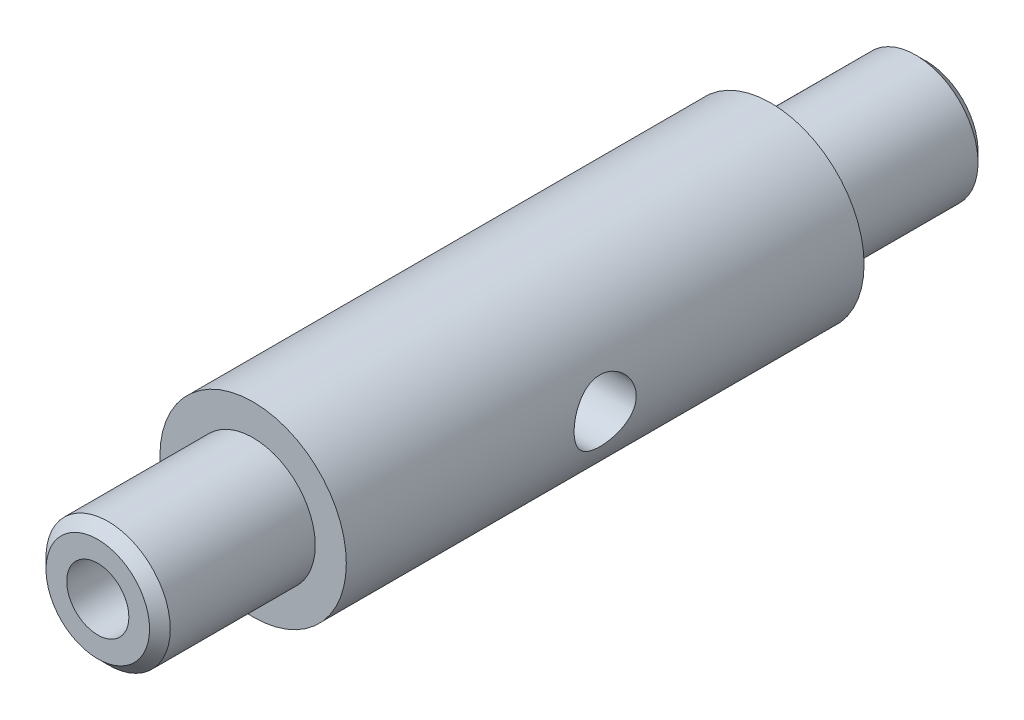
ISO-10303-21;
HEADER;
FILE_DESCRIPTION(('STEP AP214'),'2;1');
FILE_NAME('part.step','',(''),(''),'','','');
FILE_SCHEMA(('AUTOMOTIVE_DESIGN { 1 0 10303 214 1 1 1 1 }'));
ENDSEC;
DATA;
#1=APPLICATION_CONTEXT('core data for automotive mechanical design processes');
#2=APPLICATION_PROTOCOL_DEFINITION('international standard','automotive_design',2000,#1);
#3=PRODUCT_CONTEXT('',#1,'mechanical');
#4=PRODUCT('Part','Part','',(#3));
#5=PRODUCT_RELATED_PRODUCT_CATEGORY('part','',(#4));
#6=PRODUCT_DEFINITION_FORMATION('','',#4);
#7=PRODUCT_DEFINITION_CONTEXT('part definition',#1,'design');
#8=PRODUCT_DEFINITION('design','',#6,#7);
#9=PRODUCT_DEFINITION_SHAPE('','',#8);
#10=(LENGTH_UNIT() NAMED_UNIT(*) SI_UNIT(.MILLI.,.METRE.));
#11=(NAMED_UNIT(*) PLANE_ANGLE_UNIT() SI_UNIT($,.RADIAN.));
#12=(NAMED_UNIT(*) SI_UNIT($,.STERADIAN.) SOLID_ANGLE_UNIT());
#13=UNCERTAINTY_MEASURE_WITH_UNIT(LENGTH_MEASURE(1.E-05),#10,'distance_accuracy_value','');
#14=(GEOMETRIC_REPRESENTATION_CONTEXT(3) GLOBAL_UNCERTAINTY_ASSIGNED_CONTEXT((#13)) GLOBAL_UNIT_ASSIGNED_CONTEXT((#10,
#11,#12)) REPRESENTATION_CONTEXT('',''));
#15=CARTESIAN_POINT('',(0.,0.,0.));
#16=DIRECTION('',(0.,0.,1.));
#17=DIRECTION('',(1.,0.,0.));
#18=AXIS2_PLACEMENT_3D('',#15,#16,#17);
#19=CARTESIAN_POINT('',(-10.,0.,0.));
#20=DIRECTION('',(1.,0.,0.));
#21=DIRECTION('',(0.,0.,-1.));
#22=AXIS2_PLACEMENT_3D('',#19,#20,#21);
#23=CYLINDRICAL_SURFACE('',#22,3.);
#24=CARTESIAN_POINT('',(9.,0.,-3.));
#25=CARTESIAN_POINT('',(9.00000045902832,-0.16369008866017,-3.00000076119492));
#26=CARTESIAN_POINT('',(8.99549308522634,-0.32737558361565,-2.98655920161835));
#27=CARTESIAN_POINT('',(8.97795630609842,-0.649925282618917,-2.93331267354834));
#28=CARTESIAN_POINT('',(8.96492601606458,-0.808788984356454,-2.89350496815323));
#29=CARTESIAN_POINT('',(8.93175923719328,-1.11699836850533,-2.78904226984785));
#30=CARTESIAN_POINT('',(8.9116346319256,-1.2663594776581,-2.72442881262218));
#31=CARTESIAN_POINT('',(8.86633337152025,-1.55212481041597,-2.57237648148496));
#32=CARTESIAN_POINT('',(8.84115572003334,-1.68852647087612,-2.4849331049922));
#33=CARTESIAN_POINT('',(8.78742283329015,-1.9492250250668,-2.28652258542374));
#34=CARTESIAN_POINT('',(8.75878669391354,-2.07301110089493,-2.17490629721852));
#35=CARTESIAN_POINT('',(8.70180944349364,-2.30049807810625,-1.9326985358803));
#36=CARTESIAN_POINT('',(8.67346839871647,-2.40419455646839,-1.80210289521446));
#37=CARTESIAN_POINT('',(8.61939997431821,-2.59147482668358,-1.52104465441062));
#38=CARTESIAN_POINT('',(8.59377117827064,-2.6743945746631,-1.37011878080363));
#39=CARTESIAN_POINT('',(8.54925916255803,-2.81345662163317,-1.05547171662436));
#40=CARTESIAN_POINT('',(8.53037388482237,-2.8696070921603,-0.891754448511769));
#41=CARTESIAN_POINT('',(8.50233909808131,-2.95162038452749,-0.561980335509869));
#42=CARTESIAN_POINT('',(8.49288287308834,-2.97844034481531,-0.396188374532807));
#43=CARTESIAN_POINT('',(8.48386969888523,-3.00402337000343,-0.0622087375323575));
#44=CARTESIAN_POINT('',(8.4843096906819,-3.00279510481416,0.105978182127571));
#45=CARTESIAN_POINT('',(8.4947704502454,-2.97305971111026,0.431809891332064));
#46=CARTESIAN_POINT('',(8.50435247602599,-2.94580173950098,0.589585208757057));
#47=CARTESIAN_POINT('',(8.53129973173653,-2.86681848854825,0.898180258820504));
#48=CARTESIAN_POINT('',(8.54866589352323,-2.81509027977561,1.04899915630521));
#49=CARTESIAN_POINT('',(8.58953733393746,-2.68781717418063,1.34223824877444));
#50=CARTESIAN_POINT('',(8.61313697379352,-2.61190214612179,1.48448407640858));
#51=CARTESIAN_POINT('',(8.66377675727179,-2.43866731890942,1.75461272483918));
#52=CARTESIAN_POINT('',(8.69081789371391,-2.34134133709202,1.88249138080014));
#53=CARTESIAN_POINT('',(8.74701987503223,-2.12204799804671,2.12727479448232));
#54=CARTESIAN_POINT('',(8.77621768064528,-1.99905945022893,2.24325808352721));
#55=CARTESIAN_POINT('',(8.8322081516111,-1.73501870991019,2.45319379999019));
#56=CARTESIAN_POINT('',(8.85900058614202,-1.59396478698244,2.54714411449349));
#57=CARTESIAN_POINT('',(8.90751323813381,-1.2958428391388,2.71108890070521));
#58=CARTESIAN_POINT('',(8.92918050024118,-1.13862982924901,2.7808364740222));
#59=CARTESIAN_POINT('',(8.96461701433304,-0.813807250093523,2.89260952186713));
#60=CARTESIAN_POINT('',(8.97838900964638,-0.646201314464861,2.93464462627031));
#61=CARTESIAN_POINT('',(8.99602881214321,-0.313151488587913,2.98816699806708));
#62=CARTESIAN_POINT('',(9.00030005501184,-0.147928799594539,3.00089942751825));
#63=CARTESIAN_POINT('',(8.99966708084482,0.182325209880712,2.99900197920459));
#64=CARTESIAN_POINT('',(8.99476441258087,0.347356557958951,2.98437672006037));
#65=CARTESIAN_POINT('',(8.97660074151313,0.667559598912766,2.92916427679212));
#66=CARTESIAN_POINT('',(8.96358596133577,0.822878420504529,2.88934138185152));
#67=CARTESIAN_POINT('',(8.9307554049021,1.12456787573872,2.78581966659982));
#68=CARTESIAN_POINT('',(8.91093876140025,1.27093736552582,2.72211780159664));
#69=CARTESIAN_POINT('',(8.86586793861869,1.55486488917982,2.57078870447764));
#70=CARTESIAN_POINT('',(8.84048444267358,1.69208987765144,2.48257622015049));
#71=CARTESIAN_POINT('',(8.78715761748787,1.95019449040676,2.28541754995955));
#72=CARTESIAN_POINT('',(8.75921350781483,2.07106910338673,2.17646503190471));
#73=CARTESIAN_POINT('',(8.70230543941334,2.2987575234189,1.93506374698024));
#74=CARTESIAN_POINT('',(8.67335283262284,2.40468290773731,1.80177231921942));
#75=CARTESIAN_POINT('',(8.61899919884126,2.59277256697072,1.51868529656734));
#76=CARTESIAN_POINT('',(8.59359820146007,2.67493664379304,1.36888956409777));
#77=CARTESIAN_POINT('',(8.54947175374151,2.81279079124908,1.05698095413031));
#78=CARTESIAN_POINT('',(8.53073282378936,2.86853439649506,0.894893762493703));
#79=CARTESIAN_POINT('',(8.50232496919349,2.95168400027807,0.562864049867609));
#80=CARTESIAN_POINT('',(8.49265195870918,2.97910276486182,0.392925103786952));
#81=CARTESIAN_POINT('',(8.48393576622531,3.00382884743203,0.0594087118772512));
#82=CARTESIAN_POINT('',(8.48437200772245,3.0026107719252,-0.10404702086047));
#83=CARTESIAN_POINT('',(8.49453809471602,2.97372688034608,-0.428295224766187));
#84=CARTESIAN_POINT('',(8.50426738708085,2.94606263837576,-0.589087853865265));
#85=CARTESIAN_POINT('',(8.53153572914675,2.86611543938804,-0.900406989007417));
#86=CARTESIAN_POINT('',(8.54892294067433,2.81431003804654,-1.05107047501349));
#87=CARTESIAN_POINT('',(8.58949196455405,2.68793809727924,-1.34168222081481));
#88=CARTESIAN_POINT('',(8.61267506290179,2.61336650566142,-1.48162809356402));
#89=CARTESIAN_POINT('',(8.66348487678139,2.43978207775029,-1.75345100976873));
#90=CARTESIAN_POINT('',(8.69126134926411,2.33984472829374,-1.88470950569516));
#91=CARTESIAN_POINT('',(8.74750068849758,2.11992864940695,-2.1290694401526));
#92=CARTESIAN_POINT('',(8.77596374737117,1.99994425335445,-2.24216572706422));
#93=CARTESIAN_POINT('',(8.83170091576632,1.73772467076207,-2.45143323686754));
#94=CARTESIAN_POINT('',(8.8588854540377,1.59480454049919,-2.546773043253));
#95=CARTESIAN_POINT('',(8.90777973517836,1.29407207221987,-2.71197128655194));
#96=CARTESIAN_POINT('',(8.9294908772379,1.13626355439705,-2.78183623776613));
#97=CARTESIAN_POINT('',(8.96416545205626,0.817480941602928,-2.89116489746602));
#98=CARTESIAN_POINT('',(8.97747637267568,0.656963273029225,-2.93184739879013));
#99=CARTESIAN_POINT('',(8.99539221192665,0.33096124803074,-2.98626084203138));
#100=CARTESIAN_POINT('',(8.99999953595715,0.165478276706239,-2.99999923048961));
#101=CARTESIAN_POINT('',(9.,0.,-3.));
#102=B_SPLINE_CURVE_WITH_KNOTS('',3,(#24,#25,#26,#27,#28,#29,#30,#31,#32,#33,#34,#35,#36,#37,
#38,#39,#40,#41,#42,#43,#44,#45,#46,#47,#48,#49,#50,#51,#52,#53,#54,#55,#56,#57,#58,#59,#60,#61,
#62,#63,#64,#65,#66,#67,#68,#69,#70,#71,#72,#73,#74,#75,#76,#77,#78,#79,#80,#81,#82,#83,#84,#85,
#86,#87,#88,#89,#90,#91,#92,#93,#94,#95,#96,#97,#98,#99,#100,#101),.UNSPECIFIED.,.T.,.F.,(4,2,2,
2,2,2,2,2,2,2,2,2,2,2,2,2,2,2,2,2,2,2,2,2,2,2,2,2,2,2,2,2,2,2,2,2,2,2,4),(0.,0.490461318078033,
0.980973555802563,1.47066801861082,1.9604591333973,2.46554052848268,2.97073299862591,
3.49045154470411,4.010011340785,4.5120577722552,5.01394901962456,5.49290479653841,
5.97191792566446,6.45864513465392,6.94551307674622,7.45779917434101,7.97013437899855,
8.48755216951073,9.00479006631625,9.49960749525509,9.9943413949253,10.4747447393464,
10.9552093585231,11.4483119953121,11.9415654246567,12.4572306864226,12.9729002470499,
13.4875204148031,14.0019085411752,14.4898699819278,14.9778023805413,15.4564676124125,
15.9352391452793,16.4349020007541,16.9347063337134,17.453989825053,17.9731404345737,
18.4690967512144,18.9649159811442),.UNSPECIFIED.);
#103=CARTESIAN_POINT('',(9.,0.,-3.));
#104=VERTEX_POINT('',#103);
#105=EDGE_CURVE('E120',#104,#104,#102,.T.);
#106=ORIENTED_EDGE('',*,*,#105,.F.);
#107=EDGE_LOOP('',(#106));
#108=FACE_BOUND('',#107,.T.);
#109=CARTESIAN_POINT('',(0.,0.,0.));
#110=DIRECTION('',(0.707106781186548,0.,-0.707106781186547));
#111=DIRECTION('',(0.707106781186548,0.,0.707106781186547));
#112=AXIS2_PLACEMENT_3D('',#109,#110,#111);
#113=ELLIPSE('',#112,4.24264068711929,3.);
#114=CARTESIAN_POINT('',(0.,-3.,0.));
#115=VERTEX_POINT('',#114);
#116=CARTESIAN_POINT('',(0.,3.,0.));
#117=VERTEX_POINT('',#116);
#118=EDGE_CURVE('E62',#115,#117,#113,.F.);
#119=ORIENTED_EDGE('',*,*,#118,.T.);
#120=CARTESIAN_POINT('',(0.,0.,0.));
#121=DIRECTION('',(0.707106781186548,0.,0.707106781186547));
#122=DIRECTION('',(0.707106781186548,0.,-0.707106781186547));
#123=AXIS2_PLACEMENT_3D('',#120,#121,#122);
#124=ELLIPSE('',#123,4.24264068711929,3.);
#125=EDGE_CURVE('E196',#117,#115,#124,.F.);
#126=ORIENTED_EDGE('',*,*,#125,.T.);
#127=EDGE_LOOP('',(#119,#126));
#128=FACE_BOUND('',#127,.T.);
#129=ADVANCED_FACE('F46',(#108,#128),#23,.F.);
#130=CARTESIAN_POINT('',(0.,0.,25.));
#131=DIRECTION('',(0.,0.,-1.));
#132=DIRECTION('',(-1.,0.,0.));
#133=AXIS2_PLACEMENT_3D('',#130,#131,#132);
#134=CYLINDRICAL_SURFACE('',#133,9.);
#135=CARTESIAN_POINT('',(-9.,0.,3.));
#136=CARTESIAN_POINT('',(-9.00000045902832,-0.16369008866017,3.00000076119492));
#137=CARTESIAN_POINT('',(-8.99549308522634,-0.32737558361565,2.98655920161835));
#138=CARTESIAN_POINT('',(-8.97795630609842,-0.649925282618917,2.93331267354834));
#139=CARTESIAN_POINT('',(-8.96492601606458,-0.808788984356454,2.89350496815323));
#140=CARTESIAN_POINT('',(-8.93175923719328,-1.11699836850533,2.78904226984785));
#141=CARTESIAN_POINT('',(-8.9116346319256,-1.2663594776581,2.72442881262218));
#142=CARTESIAN_POINT('',(-8.86633337152025,-1.55212481041597,2.57237648148496));
#143=CARTESIAN_POINT('',(-8.84115572003334,-1.68852647087612,2.4849331049922));
#144=CARTESIAN_POINT('',(-8.78742283329015,-1.9492250250668,2.28652258542374));
#145=CARTESIAN_POINT('',(-8.75878669391354,-2.07301110089493,2.17490629721852));
#146=CARTESIAN_POINT('',(-8.70180944349364,-2.30049807810625,1.9326985358803));
#147=CARTESIAN_POINT('',(-8.67346839871647,-2.40419455646839,1.80210289521446));
#148=CARTESIAN_POINT('',(-8.61939997431821,-2.59147482668358,1.52104465441062));
#149=CARTESIAN_POINT('',(-8.59377117827064,-2.6743945746631,1.37011878080363));
#150=CARTESIAN_POINT('',(-8.54925916255803,-2.81345662163317,1.05547171662436));
#151=CARTESIAN_POINT('',(-8.53037388482237,-2.8696070921603,0.891754448511769));
#152=CARTESIAN_POINT('',(-8.50233909808131,-2.95162038452749,0.561980335509869));
#153=CARTESIAN_POINT('',(-8.49288287308834,-2.97844034481531,0.396188374532807));
#154=CARTESIAN_POINT('',(-8.48386969888523,-3.00402337000343,0.0622087375323575));
#155=CARTESIAN_POINT('',(-8.4843096906819,-3.00279510481416,-0.105978182127571));
#156=CARTESIAN_POINT('',(-8.4947704502454,-2.97305971111026,-0.431809891332064));
#157=CARTESIAN_POINT('',(-8.50435247602599,-2.94580173950098,-0.589585208757057));
#158=CARTESIAN_POINT('',(-8.53129973173653,-2.86681848854825,-0.898180258820504));
#159=CARTESIAN_POINT('',(-8.54866589352323,-2.81509027977561,-1.04899915630521));
#160=CARTESIAN_POINT('',(-8.58953733393746,-2.68781717418063,-1.34223824877444));
#161=CARTESIAN_POINT('',(-8.61313697379352,-2.61190214612179,-1.48448407640858));
#162=CARTESIAN_POINT('',(-8.66377675727179,-2.43866731890942,-1.75461272483918));
#163=CARTESIAN_POINT('',(-8.69081789371391,-2.34134133709202,-1.88249138080014));
#164=CARTESIAN_POINT('',(-8.74701987503223,-2.12204799804671,-2.12727479448232));
#165=CARTESIAN_POINT('',(-8.77621768064528,-1.99905945022893,-2.24325808352721));
#166=CARTESIAN_POINT('',(-8.8322081516111,-1.73501870991019,-2.45319379999019));
#167=CARTESIAN_POINT('',(-8.85900058614202,-1.59396478698244,-2.54714411449349));
#168=CARTESIAN_POINT('',(-8.90751323813381,-1.2958428391388,-2.71108890070521));
#169=CARTESIAN_POINT('',(-8.92918050024118,-1.13862982924901,-2.7808364740222));
#170=CARTESIAN_POINT('',(-8.96461701433304,-0.813807250093523,-2.89260952186713));
#171=CARTESIAN_POINT('',(-8.97838900964638,-0.646201314464861,-2.93464462627031));
#172=CARTESIAN_POINT('',(-8.99602881214321,-0.313151488587913,-2.98816699806708));
#173=CARTESIAN_POINT('',(-9.00030005501184,-0.147928799594539,-3.00089942751825));
#174=CARTESIAN_POINT('',(-8.99966708084482,0.182325209880712,-2.99900197920459));
#175=CARTESIAN_POINT('',(-8.99476441258087,0.347356557958951,-2.98437672006037));
#176=CARTESIAN_POINT('',(-8.97660074151313,0.667559598912766,-2.92916427679212));
#177=CARTESIAN_POINT('',(-8.96358596133577,0.822878420504529,-2.88934138185152));
#178=CARTESIAN_POINT('',(-8.9307554049021,1.12456787573872,-2.78581966659982));
#179=CARTESIAN_POINT('',(-8.91093876140025,1.27093736552582,-2.72211780159664));
#180=CARTESIAN_POINT('',(-8.86586793861869,1.55486488917982,-2.57078870447764));
#181=CARTESIAN_POINT('',(-8.84048444267358,1.69208987765144,-2.48257622015049));
#182=CARTESIAN_POINT('',(-8.78715761748787,1.95019449040676,-2.28541754995955));
#183=CARTESIAN_POINT('',(-8.75921350781483,2.07106910338673,-2.17646503190471));
#184=CARTESIAN_POINT('',(-8.70230543941334,2.2987575234189,-1.93506374698024));
#185=CARTESIAN_POINT('',(-8.67335283262284,2.40468290773731,-1.80177231921942));
#186=CARTESIAN_POINT('',(-8.61899919884126,2.59277256697072,-1.51868529656734));
#187=CARTESIAN_POINT('',(-8.59359820146007,2.67493664379304,-1.36888956409777));
#188=CARTESIAN_POINT('',(-8.54947175374151,2.81279079124908,-1.05698095413031));
#189=CARTESIAN_POINT('',(-8.53073282378936,2.86853439649506,-0.894893762493703));
#190=CARTESIAN_POINT('',(-8.50232496919349,2.95168400027807,-0.562864049867609));
#191=CARTESIAN_POINT('',(-8.49265195870918,2.97910276486182,-0.392925103786952));
#192=CARTESIAN_POINT('',(-8.48393576622531,3.00382884743203,-0.0594087118772512));
#193=CARTESIAN_POINT('',(-8.48437200772245,3.0026107719252,0.10404702086047));
#194=CARTESIAN_POINT('',(-8.49453809471602,2.97372688034608,0.428295224766187));
#195=CARTESIAN_POINT('',(-8.50426738708085,2.94606263837576,0.589087853865265));
#196=CARTESIAN_POINT('',(-8.53153572914675,2.86611543938804,0.900406989007417));
#197=CARTESIAN_POINT('',(-8.54892294067433,2.81431003804654,1.05107047501349));
#198=CARTESIAN_POINT('',(-8.58949196455405,2.68793809727924,1.34168222081481));
#199=CARTESIAN_POINT('',(-8.61267506290179,2.61336650566142,1.48162809356402));
#200=CARTESIAN_POINT('',(-8.66348487678139,2.43978207775029,1.75345100976873));
#201=CARTESIAN_POINT('',(-8.69126134926411,2.33984472829374,1.88470950569516));
#202=CARTESIAN_POINT('',(-8.74750068849758,2.11992864940695,2.1290694401526));
#203=CARTESIAN_POINT('',(-8.77596374737117,1.99994425335445,2.24216572706422));
#204=CARTESIAN_POINT('',(-8.83170091576632,1.73772467076207,2.45143323686754));
#205=CARTESIAN_POINT('',(-8.8588854540377,1.59480454049919,2.546773043253));
#206=CARTESIAN_POINT('',(-8.90777973517836,1.29407207221987,2.71197128655194));
#207=CARTESIAN_POINT('',(-8.9294908772379,1.13626355439705,2.78183623776613));
#208=CARTESIAN_POINT('',(-8.96416545205626,0.817480941602928,2.89116489746602));
#209=CARTESIAN_POINT('',(-8.97747637267568,0.656963273029225,2.93184739879013));
#210=CARTESIAN_POINT('',(-8.99539221192665,0.33096124803074,2.98626084203138));
#211=CARTESIAN_POINT('',(-8.99999953595715,0.165478276706239,2.99999923048961));
#212=CARTESIAN_POINT('',(-9.,0.,3.));
#213=B_SPLINE_CURVE_WITH_KNOTS('',3,(#135,#136,#137,#138,#139,#140,#141,#142,#143,#144,#145,
#146,#147,#148,#149,#150,#151,#152,#153,#154,#155,#156,#157,#158,#159,#160,#161,#162,#163,#164,
#165,#166,#167,#168,#169,#170,#171,#172,#173,#174,#175,#176,#177,#178,#179,#180,#181,#182,#183,
#184,#185,#186,#187,#188,#189,#190,#191,#192,#193,#194,#195,#196,#197,#198,#199,#200,#201,#202,
#203,#204,#205,#206,#207,#208,#209,#210,#211,#212),.UNSPECIFIED.,.T.,.F.,(4,2,2,2,2,2,2,2,2,2,2,
2,2,2,2,2,2,2,2,2,2,2,2,2,2,2,2,2,2,2,2,2,2,2,2,2,2,2,4),(0.,0.490461318078033,
0.980973555802563,1.47066801861082,1.9604591333973,2.46554052848268,2.97073299862591,
3.49045154470411,4.010011340785,4.5120577722552,5.01394901962456,5.49290479653841,
5.97191792566446,6.45864513465392,6.94551307674622,7.45779917434101,7.97013437899855,
8.48755216951073,9.00479006631625,9.49960749525509,9.9943413949253,10.4747447393464,
10.9552093585231,11.4483119953121,11.9415654246567,12.4572306864226,12.9729002470499,
13.4875204148031,14.0019085411752,14.4898699819278,14.9778023805413,15.4564676124125,
15.9352391452793,16.4349020007541,16.9347063337134,17.453989825053,17.9731404345737,
18.4690967512144,18.9649159811442),.UNSPECIFIED.);
#214=CARTESIAN_POINT('',(-9.,0.,3.));
#215=VERTEX_POINT('',#214);
#216=EDGE_CURVE('E117',#215,#215,#213,.T.);
#217=ORIENTED_EDGE('',*,*,#216,.T.);
#218=EDGE_LOOP('',(#217));
#219=FACE_BOUND('',#218,.T.);
#220=ORIENTED_EDGE('',*,*,#105,.T.);
#221=EDGE_LOOP('',(#220));
#222=FACE_BOUND('',#221,.T.);
#223=CARTESIAN_POINT('',(0.,0.,25.));
#224=DIRECTION('',(0.,0.,1.));
#225=DIRECTION('',(1.,0.,0.));
#226=AXIS2_PLACEMENT_3D('',#223,#224,#225);
#227=CIRCLE('',#226,9.);
#228=CARTESIAN_POINT('',(9.,0.,25.));
#229=VERTEX_POINT('',#228);
#230=EDGE_CURVE('E125',#229,#229,#227,.T.);
#231=ORIENTED_EDGE('',*,*,#230,.F.);
#232=EDGE_LOOP('',(#231));
#233=FACE_BOUND('',#232,.T.);
#234=CARTESIAN_POINT('',(0.,0.,-25.));
#235=DIRECTION('',(0.,0.,1.));
#236=DIRECTION('',(1.,0.,0.));
#237=AXIS2_PLACEMENT_3D('',#234,#235,#236);
#238=CIRCLE('',#237,9.);
#239=CARTESIAN_POINT('',(9.,0.,-25.));
#240=VERTEX_POINT('',#239);
#241=EDGE_CURVE('E119',#240,#240,#238,.T.);
#242=ORIENTED_EDGE('',*,*,#241,.T.);
#243=EDGE_LOOP('',(#242));
#244=FACE_BOUND('',#243,.T.);
#245=ADVANCED_FACE('F90',(#219,#222,#233,#244),#134,.T.);
#246=CARTESIAN_POINT('',(0.,0.,25.));
#247=DIRECTION('',(0.,0.,1.));
#248=DIRECTION('',(1.,0.,0.));
#249=AXIS2_PLACEMENT_3D('',#246,#247,#248);
#250=PLANE('',#249);
#251=CARTESIAN_POINT('',(0.,0.,25.));
#252=DIRECTION('',(0.,0.,1.));
#253=DIRECTION('',(1.,0.,0.));
#254=AXIS2_PLACEMENT_3D('',#251,#252,#253);
#255=CIRCLE('',#254,6.);
#256=CARTESIAN_POINT('',(6.,0.,25.));
#257=VERTEX_POINT('',#256);
#258=EDGE_CURVE('E170',#257,#257,#255,.T.);
#259=ORIENTED_EDGE('',*,*,#258,.F.);
#260=EDGE_LOOP('',(#259));
#261=FACE_BOUND('',#260,.T.);
#262=ORIENTED_EDGE('',*,*,#230,.T.);
#263=EDGE_LOOP('',(#262));
#264=FACE_BOUND('',#263,.T.);
#265=ADVANCED_FACE('F98',(#261,#264),#250,.T.);
#266=CARTESIAN_POINT('',(0.,0.,-25.));
#267=DIRECTION('',(0.,0.,1.));
#268=DIRECTION('',(1.,0.,0.));
#269=AXIS2_PLACEMENT_3D('',#266,#267,#268);
#270=PLANE('',#269);
#271=CARTESIAN_POINT('',(0.,0.,-25.));
#272=DIRECTION('',(0.,0.,-1.));
#273=DIRECTION('',(-1.,0.,0.));
#274=AXIS2_PLACEMENT_3D('',#271,#272,#273);
#275=CIRCLE('',#274,6.);
#276=CARTESIAN_POINT('',(-6.,0.,-25.));
#277=VERTEX_POINT('',#276);
#278=EDGE_CURVE('E168',#277,#277,#275,.T.);
#279=ORIENTED_EDGE('',*,*,#278,.F.);
#280=EDGE_LOOP('',(#279));
#281=FACE_BOUND('',#280,.T.);
#282=ORIENTED_EDGE('',*,*,#241,.F.);
#283=EDGE_LOOP('',(#282));
#284=FACE_BOUND('',#283,.T.);
#285=ADVANCED_FACE('F140',(#281,#284),#270,.F.);
#286=CARTESIAN_POINT('',(0.,0.,40.));
#287=DIRECTION('',(0.,0.,-1.));
#288=DIRECTION('',(-1.,0.,0.));
#289=AXIS2_PLACEMENT_3D('',#286,#287,#288);
#290=CYLINDRICAL_SURFACE('',#289,6.);
#291=CARTESIAN_POINT('',(0.,0.,39.));
#292=DIRECTION('',(0.,0.,1.));
#293=DIRECTION('',(1.,0.,0.));
#294=AXIS2_PLACEMENT_3D('',#291,#292,#293);
#295=CIRCLE('',#294,6.);
#296=CARTESIAN_POINT('',(6.,0.,39.));
#297=VERTEX_POINT('',#296);
#298=EDGE_CURVE('E207',#297,#297,#295,.F.);
#299=ORIENTED_EDGE('',*,*,#298,.T.);
#300=EDGE_LOOP('',(#299));
#301=FACE_BOUND('',#300,.T.);
#302=ORIENTED_EDGE('',*,*,#258,.T.);
#303=EDGE_LOOP('',(#302));
#304=FACE_BOUND('',#303,.T.);
#305=ADVANCED_FACE('F149',(#301,#304),#290,.T.);
#306=CARTESIAN_POINT('',(0.,0.,40.));
#307=DIRECTION('',(0.,0.,1.));
#308=DIRECTION('',(1.,0.,0.));
#309=AXIS2_PLACEMENT_3D('',#306,#307,#308);
#310=PLANE('',#309);
#311=CARTESIAN_POINT('',(0.,0.,40.));
#312=DIRECTION('',(0.,0.,1.));
#313=DIRECTION('',(1.,0.,0.));
#314=AXIS2_PLACEMENT_3D('',#311,#312,#313);
#315=CIRCLE('',#314,4.99999999999998);
#316=CARTESIAN_POINT('',(4.99999999999998,0.,40.));
#317=VERTEX_POINT('',#316);
#318=EDGE_CURVE('E198',#317,#317,#315,.T.);
#319=ORIENTED_EDGE('',*,*,#318,.T.);
#320=EDGE_LOOP('',(#319));
#321=FACE_BOUND('',#320,.T.);
#322=CARTESIAN_POINT('',(0.,0.,40.));
#323=DIRECTION('',(0.,0.,1.));
#324=DIRECTION('',(1.,0.,0.));
#325=AXIS2_PLACEMENT_3D('',#322,#323,#324);
#326=CIRCLE('',#325,3.);
#327=CARTESIAN_POINT('',(3.,0.,40.));
#328=VERTEX_POINT('',#327);
#329=EDGE_CURVE('E128',#328,#328,#326,.T.);
#330=ORIENTED_EDGE('',*,*,#329,.F.);
#331=EDGE_LOOP('',(#330));
#332=FACE_BOUND('',#331,.T.);
#333=ADVANCED_FACE('F155',(#321,#332),#310,.T.);
#334=CARTESIAN_POINT('',(0.,0.,-40.));
#335=DIRECTION('',(0.,0.,1.));
#336=DIRECTION('',(1.,0.,0.));
#337=AXIS2_PLACEMENT_3D('',#334,#335,#336);
#338=CYLINDRICAL_SURFACE('',#337,6.);
#339=CARTESIAN_POINT('',(0.,0.,-39.));
#340=DIRECTION('',(0.,0.,-1.));
#341=DIRECTION('',(-1.,0.,0.));
#342=AXIS2_PLACEMENT_3D('',#339,#340,#341);
#343=CIRCLE('',#342,6.);
#344=CARTESIAN_POINT('',(-6.,0.,-39.));
#345=VERTEX_POINT('',#344);
#346=EDGE_CURVE('E11',#345,#345,#343,.F.);
#347=ORIENTED_EDGE('',*,*,#346,.T.);
#348=EDGE_LOOP('',(#347));
#349=FACE_BOUND('',#348,.T.);
#350=ORIENTED_EDGE('',*,*,#278,.T.);
#351=EDGE_LOOP('',(#350));
#352=FACE_BOUND('',#351,.T.);
#353=ADVANCED_FACE('F111',(#349,#352),#338,.T.);
#354=CARTESIAN_POINT('',(0.,0.,-40.));
#355=DIRECTION('',(0.,0.,-1.));
#356=DIRECTION('',(-1.,0.,0.));
#357=AXIS2_PLACEMENT_3D('',#354,#355,#356);
#358=PLANE('',#357);
#359=CARTESIAN_POINT('',(0.,0.,-40.));
#360=DIRECTION('',(0.,0.,-1.));
#361=DIRECTION('',(-1.,0.,0.));
#362=AXIS2_PLACEMENT_3D('',#359,#360,#361);
#363=CIRCLE('',#362,4.99999999999998);
#364=CARTESIAN_POINT('',(-4.99999999999998,0.,-40.));
#365=VERTEX_POINT('',#364);
#366=EDGE_CURVE('E56',#365,#365,#363,.T.);
#367=ORIENTED_EDGE('',*,*,#366,.T.);
#368=EDGE_LOOP('',(#367));
#369=FACE_BOUND('',#368,.T.);
#370=ADVANCED_FACE('F104',(#369),#358,.T.);
#371=CARTESIAN_POINT('',(0.,0.,0.));
#372=DIRECTION('',(0.707106781186548,0.,-0.707106781186547));
#373=DIRECTION('',(0.707106781186548,0.,0.707106781186547));
#374=AXIS2_PLACEMENT_3D('',#371,#372,#373);
#375=ELLIPSE('',#374,4.24264068711929,3.);
#376=EDGE_CURVE('E69',#115,#117,#375,.T.);
#377=ORIENTED_EDGE('',*,*,#376,.T.);
#378=CARTESIAN_POINT('',(0.,0.,0.));
#379=DIRECTION('',(0.707106781186548,0.,0.707106781186547));
#380=DIRECTION('',(0.707106781186548,0.,-0.707106781186547));
#381=AXIS2_PLACEMENT_3D('',#378,#379,#380);
#382=ELLIPSE('',#381,4.24264068711929,3.);
#383=EDGE_CURVE('E195',#117,#115,#382,.T.);
#384=ORIENTED_EDGE('',*,*,#383,.T.);
#385=EDGE_LOOP('',(#377,#384));
#386=FACE_BOUND('',#385,.T.);
#387=ORIENTED_EDGE('',*,*,#216,.F.);
#388=EDGE_LOOP('',(#387));
#389=FACE_BOUND('',#388,.T.);
#390=ADVANCED_FACE('F93',(#386,#389),#23,.F.);
#391=CARTESIAN_POINT('',(0.,0.,-5.));
#392=DIRECTION('',(0.,0.,1.));
#393=DIRECTION('',(1.,0.,0.));
#394=AXIS2_PLACEMENT_3D('',#391,#392,#393);
#395=CYLINDRICAL_SURFACE('',#394,3.);
#396=ORIENTED_EDGE('',*,*,#329,.T.);
#397=EDGE_LOOP('',(#396));
#398=FACE_BOUND('',#397,.T.);
#399=ORIENTED_EDGE('',*,*,#118,.F.);
#400=ORIENTED_EDGE('',*,*,#383,.F.);
#401=EDGE_LOOP('',(#399,#400));
#402=FACE_BOUND('',#401,.T.);
#403=ADVANCED_FACE('F85',(#398,#402),#395,.F.);
#404=CARTESIAN_POINT('',(0.,0.,-5.));
#405=DIRECTION('',(0.,0.,-1.));
#406=DIRECTION('',(-1.,0.,0.));
#407=AXIS2_PLACEMENT_3D('',#404,#405,#406);
#408=CIRCLE('',#407,3.);
#409=CARTESIAN_POINT('',(-3.,0.,-5.));
#410=VERTEX_POINT('',#409);
#411=EDGE_CURVE('E189',#410,#410,#408,.T.);
#412=ORIENTED_EDGE('',*,*,#411,.T.);
#413=EDGE_LOOP('',(#412));
#414=FACE_BOUND('',#413,.T.);
#415=ORIENTED_EDGE('',*,*,#376,.F.);
#416=ORIENTED_EDGE('',*,*,#125,.F.);
#417=EDGE_LOOP('',(#415,#416));
#418=FACE_BOUND('',#417,.T.);
#419=ADVANCED_FACE('F76',(#414,#418),#395,.F.);
#420=CARTESIAN_POINT('',(0.,0.,-8.00000000000002));
#421=DIRECTION('',(0.,0.,1.));
#422=DIRECTION('',(1.,0.,0.));
#423=AXIS2_PLACEMENT_3D('',#420,#421,#422);
#424=CONICAL_SURFACE('',#423,0.,0.785398163397445);
#425=ORIENTED_EDGE('',*,*,#411,.F.);
#426=EDGE_LOOP('',(#425));
#427=FACE_BOUND('',#426,.T.);
#428=CARTESIAN_POINT('',(0.,0.,-8.00000000000002));
#429=VERTEX_POINT('',#428);
#430=VERTEX_LOOP('',#429);
#431=FACE_BOUND('',#430,.T.);
#432=ADVANCED_FACE('F73',(#427,#431),#424,.F.);
#433=CARTESIAN_POINT('',(0.,0.,40.));
#434=DIRECTION('',(0.,0.,-1.));
#435=DIRECTION('',(-1.,0.,0.));
#436=AXIS2_PLACEMENT_3D('',#433,#434,#435);
#437=CONICAL_SURFACE('',#436,4.99999999999998,0.78539816339745);
#438=ORIENTED_EDGE('',*,*,#298,.F.);
#439=EDGE_LOOP('',(#438));
#440=FACE_BOUND('',#439,.T.);
#441=ORIENTED_EDGE('',*,*,#318,.F.);
#442=EDGE_LOOP('',(#441));
#443=FACE_BOUND('',#442,.T.);
#444=ADVANCED_FACE('F75',(#440,#443),#437,.T.);
#445=CARTESIAN_POINT('',(0.,0.,-40.));
#446=DIRECTION('',(0.,0.,1.));
#447=DIRECTION('',(1.,0.,0.));
#448=AXIS2_PLACEMENT_3D('',#445,#446,#447);
#449=CONICAL_SURFACE('',#448,4.99999999999998,0.78539816339745);
#450=ORIENTED_EDGE('',*,*,#346,.F.);
#451=EDGE_LOOP('',(#450));
#452=FACE_BOUND('',#451,.T.);
#453=ORIENTED_EDGE('',*,*,#366,.F.);
#454=EDGE_LOOP('',(#453));
#455=FACE_BOUND('',#454,.T.);
#456=ADVANCED_FACE('F49',(#452,#455),#449,.T.);
#457=CLOSED_SHELL('',(#129,#245,#265,#285,#305,#333,#353,#370,#390,#403,#419,#432,#444,#456));
#458=MANIFOLD_SOLID_BREP('B2',#457);
#459=ADVANCED_BREP_SHAPE_REPRESENTATION('',(#18,#458),#14);
#460=SHAPE_DEFINITION_REPRESENTATION(#9,#459);
ENDSEC;
END-ISO-10303-21;
